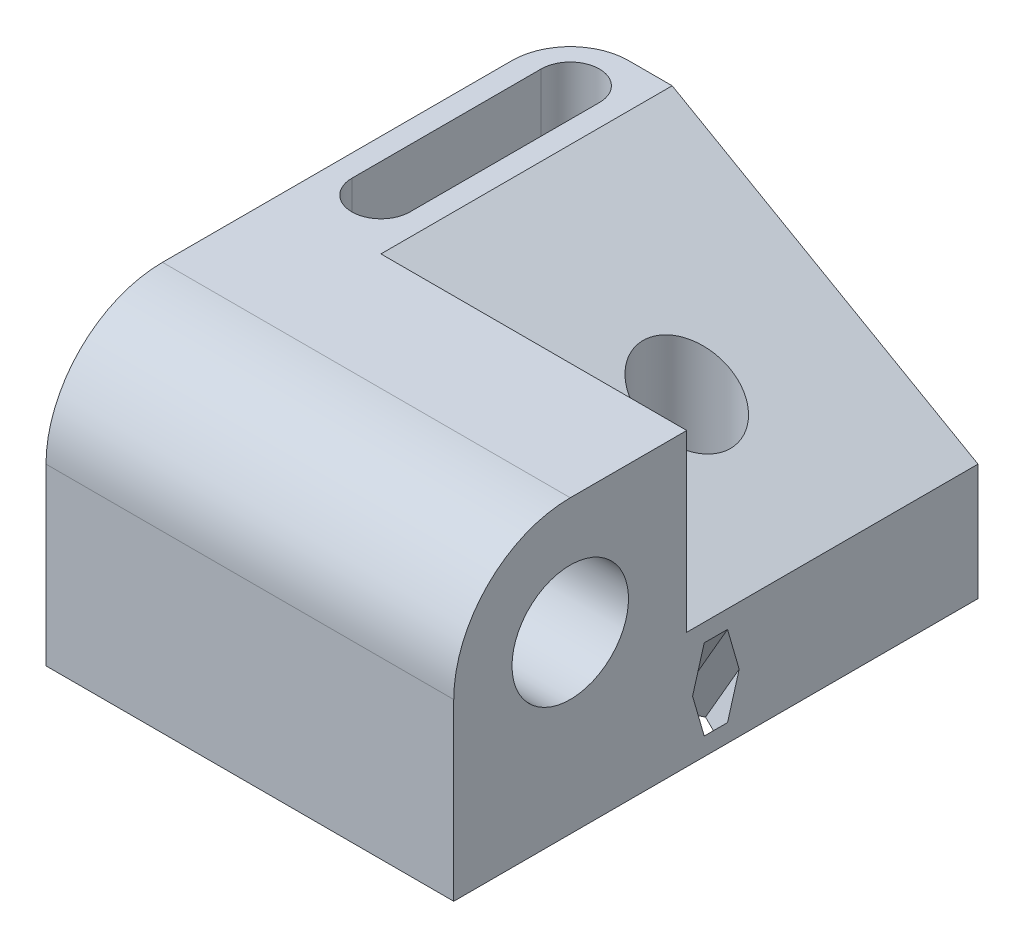
ISO-10303-21;
HEADER;
FILE_DESCRIPTION(('STEP AP214'),'2;1');
FILE_NAME('part.step','',(''),(''),'','','');
FILE_SCHEMA(('AUTOMOTIVE_DESIGN { 1 0 10303 214 1 1 1 1 }'));
ENDSEC;
DATA;
#1=APPLICATION_CONTEXT('core data for automotive mechanical design processes');
#2=APPLICATION_PROTOCOL_DEFINITION('international standard','automotive_design',2000,#1);
#3=PRODUCT_CONTEXT('',#1,'mechanical');
#4=PRODUCT('Part','Part','',(#3));
#5=PRODUCT_RELATED_PRODUCT_CATEGORY('part','',(#4));
#6=PRODUCT_DEFINITION_FORMATION('','',#4);
#7=PRODUCT_DEFINITION_CONTEXT('part definition',#1,'design');
#8=PRODUCT_DEFINITION('design','',#6,#7);
#9=PRODUCT_DEFINITION_SHAPE('','',#8);
#10=(LENGTH_UNIT() NAMED_UNIT(*) SI_UNIT(.MILLI.,.METRE.));
#11=(NAMED_UNIT(*) PLANE_ANGLE_UNIT() SI_UNIT($,.RADIAN.));
#12=(NAMED_UNIT(*) SI_UNIT($,.STERADIAN.) SOLID_ANGLE_UNIT());
#13=UNCERTAINTY_MEASURE_WITH_UNIT(LENGTH_MEASURE(1.E-05),#10,'distance_accuracy_value','');
#14=(GEOMETRIC_REPRESENTATION_CONTEXT(3) GLOBAL_UNCERTAINTY_ASSIGNED_CONTEXT((#13)) GLOBAL_UNIT_ASSIGNED_CONTEXT((#10,
#11,#12)) REPRESENTATION_CONTEXT('',''));
#15=CARTESIAN_POINT('',(0.,0.,0.));
#16=DIRECTION('',(0.,0.,1.));
#17=DIRECTION('',(1.,0.,0.));
#18=AXIS2_PLACEMENT_3D('',#15,#16,#17);
#19=CARTESIAN_POINT('',(-50.,100.,-70.));
#20=DIRECTION('',(0.,-1.,0.));
#21=DIRECTION('',(0.,0.,1.));
#22=AXIS2_PLACEMENT_3D('',#19,#20,#21);
#23=PLANE('',#22);
#24=DIRECTION('',(0.,0.,1.));
#25=VECTOR('',#24,1.);
#26=CARTESIAN_POINT('',(70.,100.,-90.));
#27=LINE('',#26,#25);
#28=CARTESIAN_POINT('',(70.,100.,10.));
#29=VERTEX_POINT('',#28);
#30=CARTESIAN_POINT('',(70.,100.,50.));
#31=VERTEX_POINT('',#30);
#32=EDGE_CURVE('E249',#29,#31,#27,.T.);
#33=ORIENTED_EDGE('',*,*,#32,.F.);
#34=DIRECTION('',(-1.,0.,0.));
#35=VECTOR('',#34,1.);
#36=CARTESIAN_POINT('',(70.,100.,10.));
#37=LINE('',#36,#35);
#38=CARTESIAN_POINT('',(-35.,100.,10.));
#39=VERTEX_POINT('',#38);
#40=EDGE_CURVE('E198',#29,#39,#37,.T.);
#41=ORIENTED_EDGE('',*,*,#40,.T.);
#42=DIRECTION('',(0.,0.,-1.));
#43=VECTOR('',#42,1.);
#44=CARTESIAN_POINT('',(-35.,100.,10.));
#45=LINE('',#44,#43);
#46=CARTESIAN_POINT('',(-35.,100.,-90.));
#47=VERTEX_POINT('',#46);
#48=EDGE_CURVE('E205',#39,#47,#45,.T.);
#49=ORIENTED_EDGE('',*,*,#48,.T.);
#50=DIRECTION('',(1.,0.,0.));
#51=VECTOR('',#50,1.);
#52=CARTESIAN_POINT('',(-49.9999999999999,100.,-90.));
#53=LINE('',#52,#51);
#54=CARTESIAN_POINT('',(-49.9999999999999,100.,-90.));
#55=VERTEX_POINT('',#54);
#56=EDGE_CURVE('E259',#55,#47,#53,.T.);
#57=ORIENTED_EDGE('',*,*,#56,.F.);
#58=CARTESIAN_POINT('',(-50.,100.,-70.));
#59=DIRECTION('',(0.,-1.,0.));
#60=DIRECTION('',(0.,0.,1.));
#61=AXIS2_PLACEMENT_3D('',#58,#59,#60);
#62=CIRCLE('',#61,20.);
#63=CARTESIAN_POINT('',(-70.,100.,-69.9999999999998));
#64=VERTEX_POINT('',#63);
#65=EDGE_CURVE('E256',#64,#55,#62,.T.);
#66=ORIENTED_EDGE('',*,*,#65,.F.);
#67=DIRECTION('',(0.,0.,-1.));
#68=VECTOR('',#67,1.);
#69=CARTESIAN_POINT('',(-70.,100.,-69.9999999999998));
#70=LINE('',#69,#68);
#71=CARTESIAN_POINT('',(-70.,100.,50.));
#72=VERTEX_POINT('',#71);
#73=EDGE_CURVE('E252',#72,#64,#70,.T.);
#74=ORIENTED_EDGE('',*,*,#73,.F.);
#75=DIRECTION('',(-1.,0.,0.));
#76=VECTOR('',#75,1.);
#77=CARTESIAN_POINT('',(-50.,100.,50.));
#78=LINE('',#77,#76);
#79=EDGE_CURVE('E285',#31,#72,#78,.T.);
#80=ORIENTED_EDGE('',*,*,#79,.F.);
#81=EDGE_LOOP('',(#33,#41,#49,#57,#66,#74,#80));
#82=FACE_BOUND('',#81,.T.);
#83=CARTESIAN_POINT('',(-52.5,100.,-7.49999999999995));
#84=DIRECTION('',(0.,-1.,0.));
#85=DIRECTION('',(0.,0.,-1.));
#86=AXIS2_PLACEMENT_3D('',#83,#84,#85);
#87=CIRCLE('',#86,9.99999999999999);
#88=CARTESIAN_POINT('',(-42.5,100.,-7.49999999999995));
#89=VERTEX_POINT('',#88);
#90=CARTESIAN_POINT('',(-62.5,100.,-7.49999999999998));
#91=VERTEX_POINT('',#90);
#92=EDGE_CURVE('E217',#89,#91,#87,.T.);
#93=ORIENTED_EDGE('',*,*,#92,.T.);
#94=DIRECTION('',(0.,0.,-1.));
#95=VECTOR('',#94,1.);
#96=CARTESIAN_POINT('',(-62.5,100.,-7.49999999999998));
#97=LINE('',#96,#95);
#98=CARTESIAN_POINT('',(-62.5,100.,-72.5));
#99=VERTEX_POINT('',#98);
#100=EDGE_CURVE('E220',#91,#99,#97,.T.);
#101=ORIENTED_EDGE('',*,*,#100,.T.);
#102=CARTESIAN_POINT('',(-52.5,100.,-72.5));
#103=DIRECTION('',(0.,-1.,0.));
#104=DIRECTION('',(0.,0.,-1.));
#105=AXIS2_PLACEMENT_3D('',#102,#103,#104);
#106=CIRCLE('',#105,9.99999999999999);
#107=CARTESIAN_POINT('',(-42.5,100.,-72.5));
#108=VERTEX_POINT('',#107);
#109=EDGE_CURVE('E224',#99,#108,#106,.T.);
#110=ORIENTED_EDGE('',*,*,#109,.T.);
#111=DIRECTION('',(0.,0.,1.));
#112=VECTOR('',#111,1.);
#113=CARTESIAN_POINT('',(-42.5,100.,-7.49999999999995));
#114=LINE('',#113,#112);
#115=EDGE_CURVE('E227',#108,#89,#114,.T.);
#116=ORIENTED_EDGE('',*,*,#115,.T.);
#117=EDGE_LOOP('',(#93,#101,#110,#116));
#118=FACE_BOUND('',#117,.T.);
#119=ADVANCED_FACE('F41',(#82,#118),#23,.F.);
#120=CARTESIAN_POINT('',(-50.,0.,-70.));
#121=DIRECTION('',(0.,-1.,0.));
#122=DIRECTION('',(0.,0.,1.));
#123=AXIS2_PLACEMENT_3D('',#120,#121,#122);
#124=PLANE('',#123);
#125=DIRECTION('',(0.894427190999916,0.,-0.447213595499958));
#126=VECTOR('',#125,1.);
#127=CARTESIAN_POINT('',(2.89059892324151,0.,35.781197846483));
#128=LINE('',#127,#126);
#129=CARTESIAN_POINT('',(58.4529946162076,0.,8.00000000000001));
#130=VERTEX_POINT('',#129);
#131=CARTESIAN_POINT('',(66.4529946162076,0.,4.));
#132=VERTEX_POINT('',#131);
#133=EDGE_CURVE('E178',#130,#132,#128,.T.);
#134=ORIENTED_EDGE('',*,*,#133,.T.);
#135=DIRECTION('',(0.,0.,-1.));
#136=VECTOR('',#135,1.);
#137=CARTESIAN_POINT('',(66.4529946162074,0.,-70.0000000000003));
#138=LINE('',#137,#136);
#139=CARTESIAN_POINT('',(66.4529946162075,0.,-3.99999999999998));
#140=VERTEX_POINT('',#139);
#141=EDGE_CURVE('E186',#132,#140,#138,.T.);
#142=ORIENTED_EDGE('',*,*,#141,.T.);
#143=DIRECTION('',(-0.894427190999915,0.,-0.44721359549996));
#144=VECTOR('',#143,1.);
#145=CARTESIAN_POINT('',(-53.1094010767584,0.,-63.7811978464832));
#146=LINE('',#145,#144);
#147=CARTESIAN_POINT('',(58.4529946162076,0.,-7.99999999999998));
#148=VERTEX_POINT('',#147);
#149=EDGE_CURVE('E191',#140,#148,#146,.T.);
#150=ORIENTED_EDGE('',*,*,#149,.T.);
#151=DIRECTION('',(-0.894427190999916,0.,0.447213595499958));
#152=VECTOR('',#151,1.);
#153=CARTESIAN_POINT('',(-3.50940107675846,0.,22.9811978464831));
#154=LINE('',#153,#152);
#155=CARTESIAN_POINT('',(50.4529946162076,0.,-3.99999999999998));
#156=VERTEX_POINT('',#155);
#157=EDGE_CURVE('E329',#148,#156,#154,.T.);
#158=ORIENTED_EDGE('',*,*,#157,.T.);
#159=DIRECTION('',(0.,0.,1.));
#160=VECTOR('',#159,1.);
#161=CARTESIAN_POINT('',(50.4529946162075,0.,-70.0000000000002));
#162=LINE('',#161,#160);
#163=CARTESIAN_POINT('',(50.4529946162076,0.,4.));
#164=VERTEX_POINT('',#163);
#165=EDGE_CURVE('E180',#156,#164,#162,.T.);
#166=ORIENTED_EDGE('',*,*,#165,.T.);
#167=DIRECTION('',(0.894427190999915,0.,0.447213595499959));
#168=VECTOR('',#167,1.);
#169=CARTESIAN_POINT('',(-59.5094010767584,0.,-50.9811978464832));
#170=LINE('',#169,#168);
#171=EDGE_CURVE('E168',#164,#130,#170,.T.);
#172=ORIENTED_EDGE('',*,*,#171,.T.);
#173=EDGE_LOOP('',(#134,#142,#150,#158,#166,#172));
#174=FACE_BOUND('',#173,.T.);
#175=DIRECTION('',(0.,0.,1.));
#176=VECTOR('',#175,1.);
#177=CARTESIAN_POINT('',(-42.5,0.,-7.49999999999995));
#178=LINE('',#177,#176);
#179=CARTESIAN_POINT('',(-42.5,0.,-72.5));
#180=VERTEX_POINT('',#179);
#181=CARTESIAN_POINT('',(-42.5,0.,-7.49999999999995));
#182=VERTEX_POINT('',#181);
#183=EDGE_CURVE('E221',#180,#182,#178,.T.);
#184=ORIENTED_EDGE('',*,*,#183,.F.);
#185=CARTESIAN_POINT('',(-52.5,0.,-72.5));
#186=DIRECTION('',(0.,-1.,0.));
#187=DIRECTION('',(0.,0.,-1.));
#188=AXIS2_PLACEMENT_3D('',#185,#186,#187);
#189=CIRCLE('',#188,9.99999999999999);
#190=CARTESIAN_POINT('',(-62.5,0.,-72.5));
#191=VERTEX_POINT('',#190);
#192=EDGE_CURVE('E236',#191,#180,#189,.T.);
#193=ORIENTED_EDGE('',*,*,#192,.F.);
#194=DIRECTION('',(0.,0.,-1.));
#195=VECTOR('',#194,1.);
#196=CARTESIAN_POINT('',(-62.5,0.,-7.49999999999998));
#197=LINE('',#196,#195);
#198=CARTESIAN_POINT('',(-62.5,0.,-7.49999999999998));
#199=VERTEX_POINT('',#198);
#200=EDGE_CURVE('E233',#199,#191,#197,.T.);
#201=ORIENTED_EDGE('',*,*,#200,.F.);
#202=CARTESIAN_POINT('',(-52.5,0.,-7.49999999999995));
#203=DIRECTION('',(0.,-1.,0.));
#204=DIRECTION('',(0.,0.,-1.));
#205=AXIS2_PLACEMENT_3D('',#202,#203,#204);
#206=CIRCLE('',#205,9.99999999999999);
#207=EDGE_CURVE('E216',#182,#199,#206,.T.);
#208=ORIENTED_EDGE('',*,*,#207,.F.);
#209=EDGE_LOOP('',(#184,#193,#201,#208));
#210=FACE_BOUND('',#209,.T.);
#211=DIRECTION('',(0.,0.,1.));
#212=VECTOR('',#211,1.);
#213=CARTESIAN_POINT('',(70.,0.,-90.));
#214=LINE('',#213,#212);
#215=CARTESIAN_POINT('',(70.,0.,-90.));
#216=VERTEX_POINT('',#215);
#217=CARTESIAN_POINT('',(70.,0.,90.));
#218=VERTEX_POINT('',#217);
#219=EDGE_CURVE('E248',#216,#218,#214,.T.);
#220=ORIENTED_EDGE('',*,*,#219,.T.);
#221=DIRECTION('',(-1.,0.,0.));
#222=VECTOR('',#221,1.);
#223=CARTESIAN_POINT('',(-70.,0.,90.));
#224=LINE('',#223,#222);
#225=CARTESIAN_POINT('',(-70.,0.,90.));
#226=VERTEX_POINT('',#225);
#227=EDGE_CURVE('E265',#218,#226,#224,.T.);
#228=ORIENTED_EDGE('',*,*,#227,.T.);
#229=DIRECTION('',(0.,0.,-1.));
#230=VECTOR('',#229,1.);
#231=CARTESIAN_POINT('',(-70.,0.,-69.9999999999998));
#232=LINE('',#231,#230);
#233=CARTESIAN_POINT('',(-70.,0.,-69.9999999999998));
#234=VERTEX_POINT('',#233);
#235=EDGE_CURVE('E268',#226,#234,#232,.T.);
#236=ORIENTED_EDGE('',*,*,#235,.T.);
#237=CARTESIAN_POINT('',(-50.,0.,-70.));
#238=DIRECTION('',(0.,-1.,0.));
#239=DIRECTION('',(0.,0.,1.));
#240=AXIS2_PLACEMENT_3D('',#237,#238,#239);
#241=CIRCLE('',#240,20.);
#242=CARTESIAN_POINT('',(-49.9999999999999,0.,-90.));
#243=VERTEX_POINT('',#242);
#244=EDGE_CURVE('E271',#234,#243,#241,.T.);
#245=ORIENTED_EDGE('',*,*,#244,.T.);
#246=DIRECTION('',(1.,0.,0.));
#247=VECTOR('',#246,1.);
#248=CARTESIAN_POINT('',(-49.9999999999999,0.,-90.));
#249=LINE('',#248,#247);
#250=EDGE_CURVE('E253',#243,#216,#249,.T.);
#251=ORIENTED_EDGE('',*,*,#250,.T.);
#252=EDGE_LOOP('',(#220,#228,#236,#245,#251));
#253=FACE_BOUND('',#252,.T.);
#254=CARTESIAN_POINT('',(25.,0.,-35.));
#255=DIRECTION('',(0.,-1.,0.));
#256=DIRECTION('',(0.,0.,-1.));
#257=AXIS2_PLACEMENT_3D('',#254,#255,#256);
#258=CIRCLE('',#257,15.);
#259=CARTESIAN_POINT('',(25.,0.,-50.));
#260=VERTEX_POINT('',#259);
#261=EDGE_CURVE('E213',#260,#260,#258,.T.);
#262=ORIENTED_EDGE('',*,*,#261,.F.);
#263=EDGE_LOOP('',(#262));
#264=FACE_BOUND('',#263,.T.);
#265=ADVANCED_FACE('F175',(#174,#210,#253,#264),#124,.T.);
#266=CARTESIAN_POINT('',(70.,100.,-90.));
#267=DIRECTION('',(-1.,0.,0.));
#268=DIRECTION('',(0.,0.,-1.));
#269=AXIS2_PLACEMENT_3D('',#266,#267,#268);
#270=PLANE('',#269);
#271=DIRECTION('',(0.,-0.960768922830523,0.277350098112614));
#272=VECTOR('',#271,1.);
#273=CARTESIAN_POINT('',(70.,119.960150637192,-20.8560099393092));
#274=LINE('',#273,#272);
#275=CARTESIAN_POINT('',(70.,33.856406460551,4.));
#276=VERTEX_POINT('',#275);
#277=CARTESIAN_POINT('',(70.,20.,8.00000000000001));
#278=VERTEX_POINT('',#277);
#279=EDGE_CURVE('E171',#276,#278,#274,.T.);
#280=ORIENTED_EDGE('',*,*,#279,.F.);
#281=DIRECTION('',(0.,0.,1.));
#282=VECTOR('',#281,1.);
#283=CARTESIAN_POINT('',(70.,33.8564064605513,-90.0000000000002));
#284=LINE('',#283,#282);
#285=CARTESIAN_POINT('',(70.,33.856406460551,-3.99999999999998));
#286=VERTEX_POINT('',#285);
#287=EDGE_CURVE('E297',#286,#276,#284,.T.);
#288=ORIENTED_EDGE('',*,*,#287,.F.);
#289=DIRECTION('',(0.,0.960768922830523,0.277350098112613));
#290=VECTOR('',#289,1.);
#291=CARTESIAN_POINT('',(70.,71.9956667352851,7.00985609315541));
#292=LINE('',#291,#290);
#293=CARTESIAN_POINT('',(70.,19.9999999999999,-7.99999999999998));
#294=VERTEX_POINT('',#293);
#295=EDGE_CURVE('E299',#294,#286,#292,.T.);
#296=ORIENTED_EDGE('',*,*,#295,.F.);
#297=DIRECTION('',(0.,0.960768922830523,-0.277350098112614));
#298=VECTOR('',#297,1.);
#299=CARTESIAN_POINT('',(70.,115.696640957023,-35.62524070854));
#300=LINE('',#299,#298);
#301=CARTESIAN_POINT('',(70.,6.14359353944884,-3.99999999999998));
#302=VERTEX_POINT('',#301);
#303=EDGE_CURVE('E302',#302,#294,#300,.T.);
#304=ORIENTED_EDGE('',*,*,#303,.F.);
#305=DIRECTION('',(0.,0.,-1.));
#306=VECTOR('',#305,1.);
#307=CARTESIAN_POINT('',(70.,6.14359353944934,-90.0000000000004));
#308=LINE('',#307,#306);
#309=CARTESIAN_POINT('',(70.,6.14359353944891,4.));
#310=VERTEX_POINT('',#309);
#311=EDGE_CURVE('E49',#310,#302,#308,.T.);
#312=ORIENTED_EDGE('',*,*,#311,.F.);
#313=DIRECTION('',(0.,-0.960768922830523,-0.277350098112613));
#314=VECTOR('',#313,1.);
#315=CARTESIAN_POINT('',(70.,67.7321570551156,21.7790868623862));
#316=LINE('',#315,#314);
#317=EDGE_CURVE('E11',#278,#310,#316,.T.);
#318=ORIENTED_EDGE('',*,*,#317,.F.);
#319=EDGE_LOOP('',(#280,#288,#296,#304,#312,#318));
#320=FACE_BOUND('',#319,.T.);
#321=CARTESIAN_POINT('',(70.,60.,50.));
#322=DIRECTION('',(-1.,0.,0.));
#323=DIRECTION('',(0.,0.,1.));
#324=AXIS2_PLACEMENT_3D('',#321,#322,#323);
#325=CIRCLE('',#324,20.);
#326=CARTESIAN_POINT('',(70.,60.,70.));
#327=VERTEX_POINT('',#326);
#328=EDGE_CURVE('E185',#327,#327,#325,.T.);
#329=ORIENTED_EDGE('',*,*,#328,.T.);
#330=EDGE_LOOP('',(#329));
#331=FACE_BOUND('',#330,.T.);
#332=DIRECTION('',(0.,-1.,0.));
#333=VECTOR('',#332,1.);
#334=CARTESIAN_POINT('',(70.,100.,90.));
#335=LINE('',#334,#333);
#336=CARTESIAN_POINT('',(70.,60.,90.));
#337=VERTEX_POINT('',#336);
#338=EDGE_CURVE('E283',#337,#218,#335,.T.);
#339=ORIENTED_EDGE('',*,*,#338,.T.);
#340=ORIENTED_EDGE('',*,*,#219,.F.);
#341=DIRECTION('',(0.,-1.,0.));
#342=VECTOR('',#341,1.);
#343=CARTESIAN_POINT('',(70.,100.,-90.));
#344=LINE('',#343,#342);
#345=CARTESIAN_POINT('',(70.,40.,-90.));
#346=VERTEX_POINT('',#345);
#347=EDGE_CURVE('E262',#346,#216,#344,.T.);
#348=ORIENTED_EDGE('',*,*,#347,.F.);
#349=DIRECTION('',(0.,0.,-1.));
#350=VECTOR('',#349,1.);
#351=CARTESIAN_POINT('',(70.,40.,10.));
#352=LINE('',#351,#350);
#353=CARTESIAN_POINT('',(70.,40.,10.));
#354=VERTEX_POINT('',#353);
#355=EDGE_CURVE('E207',#354,#346,#352,.T.);
#356=ORIENTED_EDGE('',*,*,#355,.F.);
#357=DIRECTION('',(0.,1.,0.));
#358=VECTOR('',#357,1.);
#359=CARTESIAN_POINT('',(70.,40.,10.));
#360=LINE('',#359,#358);
#361=EDGE_CURVE('E203',#354,#29,#360,.T.);
#362=ORIENTED_EDGE('',*,*,#361,.T.);
#363=ORIENTED_EDGE('',*,*,#32,.T.);
#364=CARTESIAN_POINT('',(70.,60.,50.));
#365=DIRECTION('',(1.,0.,0.));
#366=DIRECTION('',(0.,0.,-1.));
#367=AXIS2_PLACEMENT_3D('',#364,#365,#366);
#368=CIRCLE('',#367,40.);
#369=EDGE_CURVE('E294',#337,#31,#368,.F.);
#370=ORIENTED_EDGE('',*,*,#369,.F.);
#371=EDGE_LOOP('',(#339,#340,#348,#356,#362,#363,#370));
#372=FACE_BOUND('',#371,.T.);
#373=ADVANCED_FACE('F313',(#320,#331,#372),#270,.F.);
#374=CARTESIAN_POINT('',(-70.,100.,90.));
#375=DIRECTION('',(0.,0.,-1.));
#376=DIRECTION('',(1.,0.,0.));
#377=AXIS2_PLACEMENT_3D('',#374,#375,#376);
#378=PLANE('',#377);
#379=DIRECTION('',(0.,-1.,0.));
#380=VECTOR('',#379,1.);
#381=CARTESIAN_POINT('',(-70.,100.,90.));
#382=LINE('',#381,#380);
#383=CARTESIAN_POINT('',(-70.,60.,90.));
#384=VERTEX_POINT('',#383);
#385=EDGE_CURVE('E281',#384,#226,#382,.T.);
#386=ORIENTED_EDGE('',*,*,#385,.T.);
#387=ORIENTED_EDGE('',*,*,#227,.F.);
#388=ORIENTED_EDGE('',*,*,#338,.F.);
#389=DIRECTION('',(-1.,0.,0.));
#390=VECTOR('',#389,1.);
#391=CARTESIAN_POINT('',(-70.,60.,90.));
#392=LINE('',#391,#390);
#393=EDGE_CURVE('E292',#384,#337,#392,.F.);
#394=ORIENTED_EDGE('',*,*,#393,.F.);
#395=EDGE_LOOP('',(#386,#387,#388,#394));
#396=FACE_BOUND('',#395,.T.);
#397=ADVANCED_FACE('F365',(#396),#378,.F.);
#398=CARTESIAN_POINT('',(-70.,100.,-69.9999999999998));
#399=DIRECTION('',(1.,0.,0.));
#400=DIRECTION('',(0.,0.,1.));
#401=AXIS2_PLACEMENT_3D('',#398,#399,#400);
#402=PLANE('',#401);
#403=ORIENTED_EDGE('',*,*,#73,.T.);
#404=DIRECTION('',(0.,-1.,0.));
#405=VECTOR('',#404,1.);
#406=CARTESIAN_POINT('',(-70.,100.,-69.9999999999998));
#407=LINE('',#406,#405);
#408=EDGE_CURVE('E279',#64,#234,#407,.T.);
#409=ORIENTED_EDGE('',*,*,#408,.T.);
#410=ORIENTED_EDGE('',*,*,#235,.F.);
#411=ORIENTED_EDGE('',*,*,#385,.F.);
#412=CARTESIAN_POINT('',(-70.,60.,50.));
#413=DIRECTION('',(-1.,0.,0.));
#414=DIRECTION('',(0.,0.,1.));
#415=AXIS2_PLACEMENT_3D('',#412,#413,#414);
#416=CIRCLE('',#415,40.);
#417=EDGE_CURVE('E290',#72,#384,#416,.F.);
#418=ORIENTED_EDGE('',*,*,#417,.F.);
#419=EDGE_LOOP('',(#403,#409,#410,#411,#418));
#420=FACE_BOUND('',#419,.T.);
#421=ADVANCED_FACE('F361',(#420),#402,.F.);
#422=CARTESIAN_POINT('',(-50.,100.,-70.));
#423=DIRECTION('',(0.,-1.,0.));
#424=DIRECTION('',(0.,0.,1.));
#425=AXIS2_PLACEMENT_3D('',#422,#423,#424);
#426=CYLINDRICAL_SURFACE('',#425,20.);
#427=ORIENTED_EDGE('',*,*,#244,.F.);
#428=ORIENTED_EDGE('',*,*,#408,.F.);
#429=ORIENTED_EDGE('',*,*,#65,.T.);
#430=DIRECTION('',(0.,-1.,0.));
#431=VECTOR('',#430,1.);
#432=CARTESIAN_POINT('',(-49.9999999999999,100.,-90.));
#433=LINE('',#432,#431);
#434=EDGE_CURVE('E277',#55,#243,#433,.T.);
#435=ORIENTED_EDGE('',*,*,#434,.T.);
#436=EDGE_LOOP('',(#427,#428,#429,#435));
#437=FACE_BOUND('',#436,.T.);
#438=ADVANCED_FACE('F357',(#437),#426,.T.);
#439=CARTESIAN_POINT('',(-49.9999999999999,100.,-90.));
#440=DIRECTION('',(0.,0.,1.));
#441=DIRECTION('',(-1.,0.,0.));
#442=AXIS2_PLACEMENT_3D('',#439,#440,#441);
#443=PLANE('',#442);
#444=ORIENTED_EDGE('',*,*,#347,.T.);
#445=ORIENTED_EDGE('',*,*,#250,.F.);
#446=ORIENTED_EDGE('',*,*,#434,.F.);
#447=ORIENTED_EDGE('',*,*,#56,.T.);
#448=DIRECTION('',(0.868243142124459,-0.496138938356834,0.));
#449=VECTOR('',#448,1.);
#450=CARTESIAN_POINT('',(-35.,100.,-90.));
#451=LINE('',#450,#449);
#452=EDGE_CURVE('E196',#47,#346,#451,.T.);
#453=ORIENTED_EDGE('',*,*,#452,.T.);
#454=EDGE_LOOP('',(#444,#445,#446,#447,#453));
#455=FACE_BOUND('',#454,.T.);
#456=ADVANCED_FACE('F354',(#455),#443,.F.);
#457=CARTESIAN_POINT('',(-52.5,100.,-7.49999999999995));
#458=DIRECTION('',(0.,-1.,0.));
#459=DIRECTION('',(0.,0.,1.));
#460=AXIS2_PLACEMENT_3D('',#457,#458,#459);
#461=CYLINDRICAL_SURFACE('',#460,9.99999999999999);
#462=ORIENTED_EDGE('',*,*,#207,.T.);
#463=DIRECTION('',(0.,-1.,0.));
#464=VECTOR('',#463,1.);
#465=CARTESIAN_POINT('',(-62.5,100.,-7.49999999999998));
#466=LINE('',#465,#464);
#467=EDGE_CURVE('E246',#91,#199,#466,.T.);
#468=ORIENTED_EDGE('',*,*,#467,.F.);
#469=ORIENTED_EDGE('',*,*,#92,.F.);
#470=DIRECTION('',(0.,-1.,0.));
#471=VECTOR('',#470,1.);
#472=CARTESIAN_POINT('',(-42.5,100.,-7.49999999999995));
#473=LINE('',#472,#471);
#474=EDGE_CURVE('E230',#89,#182,#473,.T.);
#475=ORIENTED_EDGE('',*,*,#474,.T.);
#476=EDGE_LOOP('',(#462,#468,#469,#475));
#477=FACE_BOUND('',#476,.T.);
#478=ADVANCED_FACE('F351',(#477),#461,.F.);
#479=CARTESIAN_POINT('',(-62.5,100.,-7.49999999999998));
#480=DIRECTION('',(1.,0.,0.));
#481=DIRECTION('',(0.,0.,1.));
#482=AXIS2_PLACEMENT_3D('',#479,#480,#481);
#483=PLANE('',#482);
#484=ORIENTED_EDGE('',*,*,#200,.T.);
#485=DIRECTION('',(0.,-1.,0.));
#486=VECTOR('',#485,1.);
#487=CARTESIAN_POINT('',(-62.5,100.,-72.5));
#488=LINE('',#487,#486);
#489=EDGE_CURVE('E244',#99,#191,#488,.T.);
#490=ORIENTED_EDGE('',*,*,#489,.F.);
#491=ORIENTED_EDGE('',*,*,#100,.F.);
#492=ORIENTED_EDGE('',*,*,#467,.T.);
#493=EDGE_LOOP('',(#484,#490,#491,#492));
#494=FACE_BOUND('',#493,.T.);
#495=ADVANCED_FACE('F396',(#494),#483,.T.);
#496=CARTESIAN_POINT('',(-52.5,100.,-72.5));
#497=DIRECTION('',(0.,-1.,0.));
#498=DIRECTION('',(0.,0.,1.));
#499=AXIS2_PLACEMENT_3D('',#496,#497,#498);
#500=CYLINDRICAL_SURFACE('',#499,9.99999999999999);
#501=ORIENTED_EDGE('',*,*,#192,.T.);
#502=DIRECTION('',(0.,-1.,0.));
#503=VECTOR('',#502,1.);
#504=CARTESIAN_POINT('',(-42.5,100.,-72.5));
#505=LINE('',#504,#503);
#506=EDGE_CURVE('E242',#108,#180,#505,.T.);
#507=ORIENTED_EDGE('',*,*,#506,.F.);
#508=ORIENTED_EDGE('',*,*,#109,.F.);
#509=ORIENTED_EDGE('',*,*,#489,.T.);
#510=EDGE_LOOP('',(#501,#507,#508,#509));
#511=FACE_BOUND('',#510,.T.);
#512=ADVANCED_FACE('F403',(#511),#500,.F.);
#513=CARTESIAN_POINT('',(-42.5,100.,-7.49999999999995));
#514=DIRECTION('',(-1.,0.,0.));
#515=DIRECTION('',(0.,0.,-1.));
#516=AXIS2_PLACEMENT_3D('',#513,#514,#515);
#517=PLANE('',#516);
#518=ORIENTED_EDGE('',*,*,#183,.T.);
#519=ORIENTED_EDGE('',*,*,#474,.F.);
#520=ORIENTED_EDGE('',*,*,#115,.F.);
#521=ORIENTED_EDGE('',*,*,#506,.T.);
#522=EDGE_LOOP('',(#518,#519,#520,#521));
#523=FACE_BOUND('',#522,.T.);
#524=ADVANCED_FACE('F410',(#523),#517,.T.);
#525=CARTESIAN_POINT('',(25.,100.,-35.));
#526=DIRECTION('',(0.,-1.,0.));
#527=DIRECTION('',(0.,0.,1.));
#528=AXIS2_PLACEMENT_3D('',#525,#526,#527);
#529=CYLINDRICAL_SURFACE('',#528,15.);
#530=CARTESIAN_POINT('',(25.,65.7142857142857,-35.));
#531=DIRECTION('',(0.496138938356834,0.868243142124459,0.));
#532=DIRECTION('',(0.868243142124459,-0.496138938356834,0.));
#533=AXIS2_PLACEMENT_3D('',#530,#531,#532);
#534=ELLIPSE('',#533,17.2762666034969,15.);
#535=CARTESIAN_POINT('',(40.,57.1428571428572,-35.));
#536=VERTEX_POINT('',#535);
#537=EDGE_CURVE('E210',#536,#536,#534,.T.);
#538=ORIENTED_EDGE('',*,*,#537,.T.);
#539=EDGE_LOOP('',(#538));
#540=FACE_BOUND('',#539,.T.);
#541=ORIENTED_EDGE('',*,*,#261,.T.);
#542=EDGE_LOOP('',(#541));
#543=FACE_BOUND('',#542,.T.);
#544=ADVANCED_FACE('F418',(#540,#543),#529,.F.);
#545=CARTESIAN_POINT('',(-35.,100.,10.));
#546=DIRECTION('',(-0.496138938356834,-0.868243142124459,0.));
#547=DIRECTION('',(0.868243142124459,-0.496138938356834,0.));
#548=AXIS2_PLACEMENT_3D('',#545,#546,#547);
#549=PLANE('',#548);
#550=ORIENTED_EDGE('',*,*,#537,.F.);
#551=EDGE_LOOP('',(#550));
#552=FACE_BOUND('',#551,.T.);
#553=ORIENTED_EDGE('',*,*,#452,.F.);
#554=ORIENTED_EDGE('',*,*,#48,.F.);
#555=DIRECTION('',(0.868243142124459,-0.496138938356834,0.));
#556=VECTOR('',#555,1.);
#557=CARTESIAN_POINT('',(-35.,100.,10.));
#558=LINE('',#557,#556);
#559=EDGE_CURVE('E201',#39,#354,#558,.T.);
#560=ORIENTED_EDGE('',*,*,#559,.T.);
#561=ORIENTED_EDGE('',*,*,#355,.T.);
#562=EDGE_LOOP('',(#553,#554,#560,#561));
#563=FACE_BOUND('',#562,.T.);
#564=ADVANCED_FACE('F426',(#552,#563),#549,.F.);
#565=CARTESIAN_POINT('',(0.,0.,10.));
#566=DIRECTION('',(0.,0.,1.));
#567=DIRECTION('',(-1.,0.,0.));
#568=AXIS2_PLACEMENT_3D('',#565,#566,#567);
#569=PLANE('',#568);
#570=ORIENTED_EDGE('',*,*,#40,.F.);
#571=ORIENTED_EDGE('',*,*,#361,.F.);
#572=ORIENTED_EDGE('',*,*,#559,.F.);
#573=EDGE_LOOP('',(#570,#571,#572));
#574=FACE_BOUND('',#573,.T.);
#575=ADVANCED_FACE('F434',(#574),#569,.F.);
#576=CARTESIAN_POINT('',(-50.,60.,50.));
#577=DIRECTION('',(-1.,0.,0.));
#578=DIRECTION('',(0.,0.,-1.));
#579=AXIS2_PLACEMENT_3D('',#576,#577,#578);
#580=CYLINDRICAL_SURFACE('',#579,40.);
#581=ORIENTED_EDGE('',*,*,#369,.T.);
#582=ORIENTED_EDGE('',*,*,#79,.T.);
#583=ORIENTED_EDGE('',*,*,#417,.T.);
#584=ORIENTED_EDGE('',*,*,#393,.T.);
#585=EDGE_LOOP('',(#581,#582,#583,#584));
#586=FACE_BOUND('',#585,.T.);
#587=ADVANCED_FACE('F43',(#586),#580,.T.);
#588=CARTESIAN_POINT('',(-35.,60.,50.));
#589=DIRECTION('',(1.,0.,0.));
#590=DIRECTION('',(0.,0.,1.));
#591=AXIS2_PLACEMENT_3D('',#588,#589,#590);
#592=CYLINDRICAL_SURFACE('',#591,20.);
#593=CARTESIAN_POINT('',(-35.,60.,50.));
#594=DIRECTION('',(-1.,0.,0.));
#595=DIRECTION('',(0.,0.,1.));
#596=AXIS2_PLACEMENT_3D('',#593,#594,#595);
#597=CIRCLE('',#596,20.);
#598=CARTESIAN_POINT('',(-35.,60.,70.));
#599=VERTEX_POINT('',#598);
#600=EDGE_CURVE('E189',#599,#599,#597,.T.);
#601=ORIENTED_EDGE('',*,*,#600,.T.);
#602=EDGE_LOOP('',(#601));
#603=FACE_BOUND('',#602,.T.);
#604=ORIENTED_EDGE('',*,*,#328,.F.);
#605=EDGE_LOOP('',(#604));
#606=FACE_BOUND('',#605,.T.);
#607=ADVANCED_FACE('F449',(#603,#606),#592,.F.);
#608=CARTESIAN_POINT('',(-35.,60.,50.));
#609=DIRECTION('',(1.,0.,0.));
#610=DIRECTION('',(0.,0.,1.));
#611=AXIS2_PLACEMENT_3D('',#608,#609,#610);
#612=PLANE('',#611);
#613=ORIENTED_EDGE('',*,*,#600,.F.);
#614=EDGE_LOOP('',(#613));
#615=FACE_BOUND('',#614,.T.);
#616=ADVANCED_FACE('F456',(#615),#612,.T.);
#617=CARTESIAN_POINT('',(32.3397459621559,-59.0858798800484,4.));
#618=DIRECTION('',(0.433012701892219,-0.249999999999999,0.866025403784439));
#619=DIRECTION('',(-0.894427190999916,0.,0.447213595499958));
#620=AXIS2_PLACEMENT_3D('',#617,#618,#619);
#621=PLANE('',#620);
#622=ORIENTED_EDGE('',*,*,#133,.F.);
#623=DIRECTION('',(0.499999999999998,0.86602540378444,0.));
#624=VECTOR('',#623,1.);
#625=CARTESIAN_POINT('',(26.3397459621559,-55.6217782649106,8.00000000000001));
#626=LINE('',#625,#624);
#627=EDGE_CURVE('E63',#130,#278,#626,.T.);
#628=ORIENTED_EDGE('',*,*,#627,.T.);
#629=ORIENTED_EDGE('',*,*,#317,.T.);
#630=DIRECTION('',(0.499999999999998,0.86602540378444,0.));
#631=VECTOR('',#630,1.);
#632=CARTESIAN_POINT('',(32.3397459621559,-59.0858798800484,4.));
#633=LINE('',#632,#631);
#634=EDGE_CURVE('E181',#132,#310,#633,.T.);
#635=ORIENTED_EDGE('',*,*,#634,.F.);
#636=EDGE_LOOP('',(#622,#628,#629,#635));
#637=FACE_BOUND('',#636,.T.);
#638=ADVANCED_FACE('F183',(#637),#621,.F.);
#639=CARTESIAN_POINT('',(32.3397459621559,-59.0858798800484,-3.99999999999998));
#640=DIRECTION('',(0.86602540378444,-0.499999999999998,0.));
#641=DIRECTION('',(0.499999999999998,0.86602540378444,0.));
#642=AXIS2_PLACEMENT_3D('',#639,#640,#641);
#643=PLANE('',#642);
#644=ORIENTED_EDGE('',*,*,#141,.F.);
#645=ORIENTED_EDGE('',*,*,#634,.T.);
#646=ORIENTED_EDGE('',*,*,#311,.T.);
#647=DIRECTION('',(0.499999999999998,0.86602540378444,0.));
#648=VECTOR('',#647,1.);
#649=CARTESIAN_POINT('',(32.3397459621559,-59.0858798800484,-3.99999999999998));
#650=LINE('',#649,#648);
#651=EDGE_CURVE('E309',#140,#302,#650,.T.);
#652=ORIENTED_EDGE('',*,*,#651,.F.);
#653=EDGE_LOOP('',(#644,#645,#646,#652));
#654=FACE_BOUND('',#653,.T.);
#655=ADVANCED_FACE('F308',(#654),#643,.F.);
#656=CARTESIAN_POINT('',(26.3397459621559,-55.6217782649106,-7.99999999999998));
#657=DIRECTION('',(0.433012701892221,-0.25,-0.866025403784438));
#658=DIRECTION('',(0.894427190999915,0.,0.44721359549996));
#659=AXIS2_PLACEMENT_3D('',#656,#657,#658);
#660=PLANE('',#659);
#661=ORIENTED_EDGE('',*,*,#149,.F.);
#662=ORIENTED_EDGE('',*,*,#651,.T.);
#663=ORIENTED_EDGE('',*,*,#303,.T.);
#664=DIRECTION('',(0.499999999999998,0.86602540378444,0.));
#665=VECTOR('',#664,1.);
#666=CARTESIAN_POINT('',(26.3397459621559,-55.6217782649106,-7.99999999999998));
#667=LINE('',#666,#665);
#668=EDGE_CURVE('E318',#148,#294,#667,.T.);
#669=ORIENTED_EDGE('',*,*,#668,.F.);
#670=EDGE_LOOP('',(#661,#662,#663,#669));
#671=FACE_BOUND('',#670,.T.);
#672=ADVANCED_FACE('F317',(#671),#660,.F.);
#673=CARTESIAN_POINT('',(20.3397459621559,-52.1576766497729,-3.99999999999998));
#674=DIRECTION('',(-0.43301270189222,0.249999999999999,-0.866025403784439));
#675=DIRECTION('',(0.894427190999916,0.,-0.447213595499958));
#676=AXIS2_PLACEMENT_3D('',#673,#674,#675);
#677=PLANE('',#676);
#678=ORIENTED_EDGE('',*,*,#157,.F.);
#679=ORIENTED_EDGE('',*,*,#668,.T.);
#680=ORIENTED_EDGE('',*,*,#295,.T.);
#681=DIRECTION('',(0.499999999999998,0.86602540378444,0.));
#682=VECTOR('',#681,1.);
#683=CARTESIAN_POINT('',(20.3397459621559,-52.1576766497729,-3.99999999999998));
#684=LINE('',#683,#682);
#685=EDGE_CURVE('E323',#156,#286,#684,.T.);
#686=ORIENTED_EDGE('',*,*,#685,.F.);
#687=EDGE_LOOP('',(#678,#679,#680,#686));
#688=FACE_BOUND('',#687,.T.);
#689=ADVANCED_FACE('F331',(#688),#677,.F.);
#690=CARTESIAN_POINT('',(20.3397459621559,-52.1576766497729,4.));
#691=DIRECTION('',(-0.86602540378444,0.499999999999998,0.));
#692=DIRECTION('',(-0.499999999999998,-0.86602540378444,0.));
#693=AXIS2_PLACEMENT_3D('',#690,#691,#692);
#694=PLANE('',#693);
#695=ORIENTED_EDGE('',*,*,#165,.F.);
#696=ORIENTED_EDGE('',*,*,#685,.T.);
#697=ORIENTED_EDGE('',*,*,#287,.T.);
#698=DIRECTION('',(0.499999999999998,0.86602540378444,0.));
#699=VECTOR('',#698,1.);
#700=CARTESIAN_POINT('',(20.3397459621559,-52.1576766497729,4.));
#701=LINE('',#700,#699);
#702=EDGE_CURVE('E56',#164,#276,#701,.T.);
#703=ORIENTED_EDGE('',*,*,#702,.F.);
#704=EDGE_LOOP('',(#695,#696,#697,#703));
#705=FACE_BOUND('',#704,.T.);
#706=ADVANCED_FACE('F332',(#705),#694,.F.);
#707=CARTESIAN_POINT('',(26.3397459621559,-55.6217782649106,8.00000000000001));
#708=DIRECTION('',(-0.43301270189222,0.249999999999999,0.866025403784438));
#709=DIRECTION('',(-0.894427190999915,0.,-0.447213595499959));
#710=AXIS2_PLACEMENT_3D('',#707,#708,#709);
#711=PLANE('',#710);
#712=ORIENTED_EDGE('',*,*,#171,.F.);
#713=ORIENTED_EDGE('',*,*,#702,.T.);
#714=ORIENTED_EDGE('',*,*,#279,.T.);
#715=ORIENTED_EDGE('',*,*,#627,.F.);
#716=EDGE_LOOP('',(#712,#713,#714,#715));
#717=FACE_BOUND('',#716,.T.);
#718=ADVANCED_FACE('F167',(#717),#711,.F.);
#719=CLOSED_SHELL('',(#119,#265,#373,#397,#421,#438,#456,#478,#495,#512,#524,#544,#564,#575,
#587,#607,#616,#638,#655,#672,#689,#706,#718));
#720=MANIFOLD_SOLID_BREP('B2',#719);
#721=ADVANCED_BREP_SHAPE_REPRESENTATION('',(#18,#720),#14);
#722=SHAPE_DEFINITION_REPRESENTATION(#9,#721);
ENDSEC;
END-ISO-10303-21;
